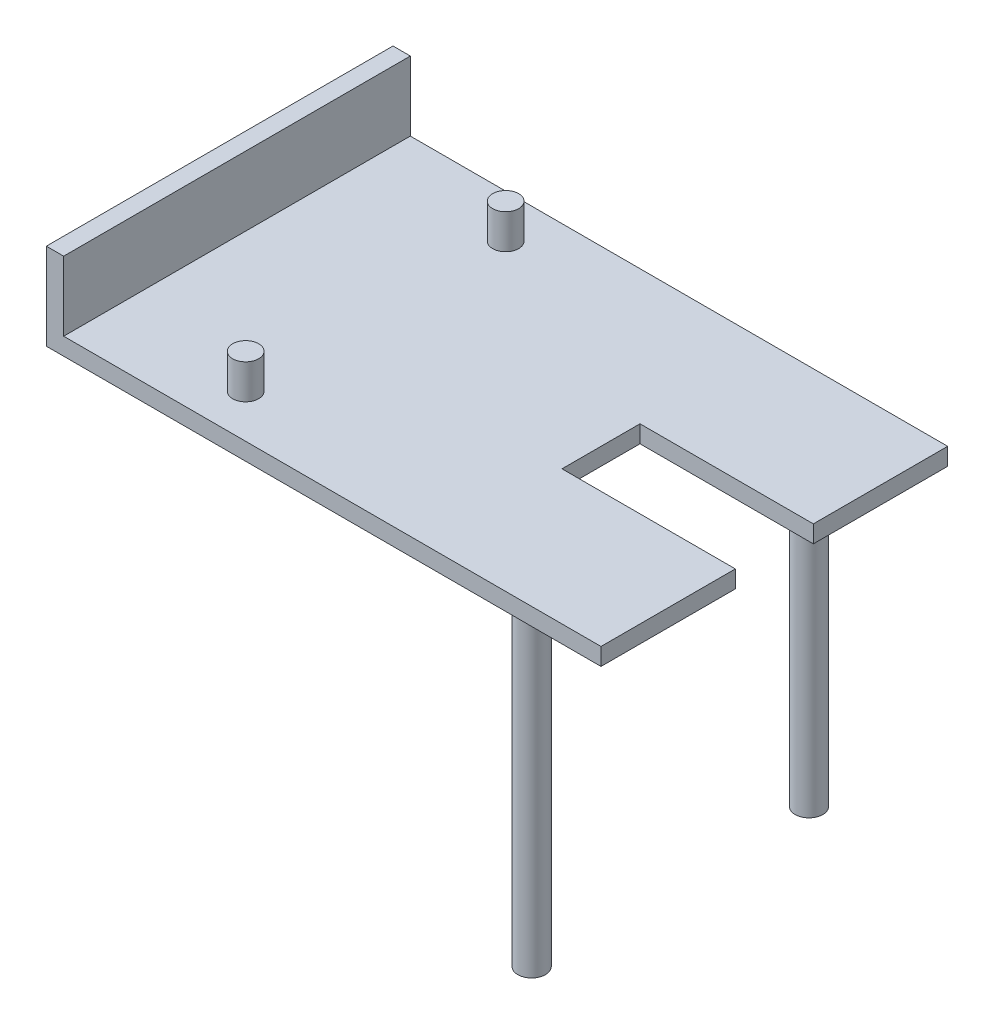
ISO-10303-21;
HEADER;
FILE_DESCRIPTION(('STEP AP214'),'2;1');
FILE_NAME('part.step','',(''),(''),'','','');
FILE_SCHEMA(('AUTOMOTIVE_DESIGN { 1 0 10303 214 1 1 1 1 }'));
ENDSEC;
DATA;
#1=APPLICATION_CONTEXT('core data for automotive mechanical design processes');
#2=APPLICATION_PROTOCOL_DEFINITION('international standard','automotive_design',2000,#1);
#3=PRODUCT_CONTEXT('',#1,'mechanical');
#4=PRODUCT('Part','Part','',(#3));
#5=PRODUCT_RELATED_PRODUCT_CATEGORY('part','',(#4));
#6=PRODUCT_DEFINITION_FORMATION('','',#4);
#7=PRODUCT_DEFINITION_CONTEXT('part definition',#1,'design');
#8=PRODUCT_DEFINITION('design','',#6,#7);
#9=PRODUCT_DEFINITION_SHAPE('','',#8);
#10=(LENGTH_UNIT() NAMED_UNIT(*) SI_UNIT(.MILLI.,.METRE.));
#11=(NAMED_UNIT(*) PLANE_ANGLE_UNIT() SI_UNIT($,.RADIAN.));
#12=(NAMED_UNIT(*) SI_UNIT($,.STERADIAN.) SOLID_ANGLE_UNIT());
#13=UNCERTAINTY_MEASURE_WITH_UNIT(LENGTH_MEASURE(1.E-05),#10,'distance_accuracy_value','');
#14=(GEOMETRIC_REPRESENTATION_CONTEXT(3) GLOBAL_UNCERTAINTY_ASSIGNED_CONTEXT((#13)) GLOBAL_UNIT_ASSIGNED_CONTEXT((#10,
#11,#12)) REPRESENTATION_CONTEXT('',''));
#15=CARTESIAN_POINT('',(0.,0.,0.));
#16=DIRECTION('',(0.,0.,1.));
#17=DIRECTION('',(1.,0.,0.));
#18=AXIS2_PLACEMENT_3D('',#15,#16,#17);
#19=CARTESIAN_POINT('',(320.,0.,200.));
#20=DIRECTION('',(-1.,0.,0.));
#21=DIRECTION('',(0.,0.,1.));
#22=AXIS2_PLACEMENT_3D('',#19,#20,#21);
#23=PLANE('',#22);
#24=DIRECTION('',(0.,0.,-1.));
#25=VECTOR('',#24,1.);
#26=CARTESIAN_POINT('',(320.,0.,200.));
#27=LINE('',#26,#25);
#28=CARTESIAN_POINT('',(320.,0.,200.));
#29=VERTEX_POINT('',#28);
#30=CARTESIAN_POINT('',(320.,0.,122.5));
#31=VERTEX_POINT('',#30);
#32=EDGE_CURVE('E124',#29,#31,#27,.T.);
#33=ORIENTED_EDGE('',*,*,#32,.T.);
#34=DIRECTION('',(0.,1.,0.));
#35=VECTOR('',#34,1.);
#36=CARTESIAN_POINT('',(320.,0.,122.5));
#37=LINE('',#36,#35);
#38=CARTESIAN_POINT('',(320.,10.,122.5));
#39=VERTEX_POINT('',#38);
#40=EDGE_CURVE('E217',#31,#39,#37,.T.);
#41=ORIENTED_EDGE('',*,*,#40,.T.);
#42=DIRECTION('',(0.,0.,-1.));
#43=VECTOR('',#42,1.);
#44=CARTESIAN_POINT('',(320.,10.,200.));
#45=LINE('',#44,#43);
#46=CARTESIAN_POINT('',(320.,10.,200.));
#47=VERTEX_POINT('',#46);
#48=EDGE_CURVE('E159',#47,#39,#45,.T.);
#49=ORIENTED_EDGE('',*,*,#48,.F.);
#50=DIRECTION('',(0.,1.,0.));
#51=VECTOR('',#50,1.);
#52=CARTESIAN_POINT('',(320.,0.,200.));
#53=LINE('',#52,#51);
#54=EDGE_CURVE('E67',#29,#47,#53,.T.);
#55=ORIENTED_EDGE('',*,*,#54,.F.);
#56=EDGE_LOOP('',(#33,#41,#49,#55));
#57=FACE_BOUND('',#56,.T.);
#58=ADVANCED_FACE('F41',(#57),#23,.F.);
#59=CARTESIAN_POINT('',(0.,10.,200.));
#60=DIRECTION('',(0.,1.,0.));
#61=DIRECTION('',(0.,0.,1.));
#62=AXIS2_PLACEMENT_3D('',#59,#60,#61);
#63=PLANE('',#62);
#64=DIRECTION('',(1.,0.,0.));
#65=VECTOR('',#64,1.);
#66=CARTESIAN_POINT('',(320.,10.,122.5));
#67=LINE('',#66,#65);
#68=CARTESIAN_POINT('',(220.,10.,122.5));
#69=VERTEX_POINT('',#68);
#70=EDGE_CURVE('E220',#69,#39,#67,.T.);
#71=ORIENTED_EDGE('',*,*,#70,.F.);
#72=DIRECTION('',(0.,0.,1.));
#73=VECTOR('',#72,1.);
#74=CARTESIAN_POINT('',(220.,10.,77.5));
#75=LINE('',#74,#73);
#76=CARTESIAN_POINT('',(220.,10.,77.5));
#77=VERTEX_POINT('',#76);
#78=EDGE_CURVE('E223',#77,#69,#75,.T.);
#79=ORIENTED_EDGE('',*,*,#78,.F.);
#80=DIRECTION('',(-1.,0.,0.));
#81=VECTOR('',#80,1.);
#82=CARTESIAN_POINT('',(320.,10.,77.4999999999999));
#83=LINE('',#82,#81);
#84=CARTESIAN_POINT('',(320.,10.,77.4999999999999));
#85=VERTEX_POINT('',#84);
#86=EDGE_CURVE('E226',#85,#77,#83,.T.);
#87=ORIENTED_EDGE('',*,*,#86,.F.);
#88=CARTESIAN_POINT('',(320.,10.,0.));
#89=VERTEX_POINT('',#88);
#90=EDGE_CURVE('E94',#85,#89,#45,.T.);
#91=ORIENTED_EDGE('',*,*,#90,.T.);
#92=DIRECTION('',(1.,0.,0.));
#93=VECTOR('',#92,1.);
#94=CARTESIAN_POINT('',(0.,10.,0.));
#95=LINE('',#94,#93);
#96=CARTESIAN_POINT('',(10.,10.,0.));
#97=VERTEX_POINT('',#96);
#98=EDGE_CURVE('E143',#97,#89,#95,.T.);
#99=ORIENTED_EDGE('',*,*,#98,.F.);
#100=DIRECTION('',(0.,0.,-1.));
#101=VECTOR('',#100,1.);
#102=CARTESIAN_POINT('',(10.,10.,200.));
#103=LINE('',#102,#101);
#104=CARTESIAN_POINT('',(10.,10.,200.));
#105=VERTEX_POINT('',#104);
#106=EDGE_CURVE('E11',#105,#97,#103,.T.);
#107=ORIENTED_EDGE('',*,*,#106,.F.);
#108=DIRECTION('',(1.,0.,0.));
#109=VECTOR('',#108,1.);
#110=CARTESIAN_POINT('',(0.,10.,200.));
#111=LINE('',#110,#109);
#112=EDGE_CURVE('E158',#105,#47,#111,.T.);
#113=ORIENTED_EDGE('',*,*,#112,.T.);
#114=ORIENTED_EDGE('',*,*,#48,.T.);
#115=EDGE_LOOP('',(#71,#79,#87,#91,#99,#107,#113,#114));
#116=FACE_BOUND('',#115,.T.);
#117=CARTESIAN_POINT('',(90.,10.,175.));
#118=DIRECTION('',(0.,1.,0.));
#119=DIRECTION('',(0.,0.,1.));
#120=AXIS2_PLACEMENT_3D('',#117,#118,#119);
#121=CIRCLE('',#120,7.50000000000001);
#122=CARTESIAN_POINT('',(90.,10.,182.5));
#123=VERTEX_POINT('',#122);
#124=EDGE_CURVE('E172',#123,#123,#121,.T.);
#125=ORIENTED_EDGE('',*,*,#124,.F.);
#126=EDGE_LOOP('',(#125));
#127=FACE_BOUND('',#126,.T.);
#128=CARTESIAN_POINT('',(90.,10.,25.));
#129=DIRECTION('',(0.,1.,0.));
#130=DIRECTION('',(0.,0.,1.));
#131=AXIS2_PLACEMENT_3D('',#128,#129,#130);
#132=CIRCLE('',#131,7.50000000000001);
#133=CARTESIAN_POINT('',(90.,10.,32.5));
#134=VERTEX_POINT('',#133);
#135=EDGE_CURVE('E184',#134,#134,#132,.T.);
#136=ORIENTED_EDGE('',*,*,#135,.F.);
#137=EDGE_LOOP('',(#136));
#138=FACE_BOUND('',#137,.T.);
#139=ADVANCED_FACE('F43',(#116,#127,#138),#63,.T.);
#140=CARTESIAN_POINT('',(10.,0.,200.));
#141=DIRECTION('',(-1.,0.,0.));
#142=DIRECTION('',(0.,0.,1.));
#143=AXIS2_PLACEMENT_3D('',#140,#141,#142);
#144=PLANE('',#143);
#145=DIRECTION('',(0.,1.,0.));
#146=VECTOR('',#145,1.);
#147=CARTESIAN_POINT('',(10.,0.,0.));
#148=LINE('',#147,#146);
#149=CARTESIAN_POINT('',(10.,50.,0.));
#150=VERTEX_POINT('',#149);
#151=EDGE_CURVE('E146',#97,#150,#148,.T.);
#152=ORIENTED_EDGE('',*,*,#151,.T.);
#153=DIRECTION('',(0.,0.,-1.));
#154=VECTOR('',#153,1.);
#155=CARTESIAN_POINT('',(10.,50.,200.));
#156=LINE('',#155,#154);
#157=CARTESIAN_POINT('',(10.,50.,200.));
#158=VERTEX_POINT('',#157);
#159=EDGE_CURVE('E50',#158,#150,#156,.T.);
#160=ORIENTED_EDGE('',*,*,#159,.F.);
#161=DIRECTION('',(0.,1.,0.));
#162=VECTOR('',#161,1.);
#163=CARTESIAN_POINT('',(10.,0.,200.));
#164=LINE('',#163,#162);
#165=EDGE_CURVE('E138',#105,#158,#164,.T.);
#166=ORIENTED_EDGE('',*,*,#165,.F.);
#167=ORIENTED_EDGE('',*,*,#106,.T.);
#168=EDGE_LOOP('',(#152,#160,#166,#167));
#169=FACE_BOUND('',#168,.T.);
#170=ADVANCED_FACE('F192',(#169),#144,.F.);
#171=CARTESIAN_POINT('',(0.,50.,200.));
#172=DIRECTION('',(0.,1.,0.));
#173=DIRECTION('',(0.,0.,1.));
#174=AXIS2_PLACEMENT_3D('',#171,#172,#173);
#175=PLANE('',#174);
#176=DIRECTION('',(1.,0.,0.));
#177=VECTOR('',#176,1.);
#178=CARTESIAN_POINT('',(0.,50.,0.));
#179=LINE('',#178,#177);
#180=CARTESIAN_POINT('',(0.,50.,0.));
#181=VERTEX_POINT('',#180);
#182=EDGE_CURVE('E150',#181,#150,#179,.T.);
#183=ORIENTED_EDGE('',*,*,#182,.F.);
#184=DIRECTION('',(0.,0.,-1.));
#185=VECTOR('',#184,1.);
#186=CARTESIAN_POINT('',(0.,50.,200.));
#187=LINE('',#186,#185);
#188=CARTESIAN_POINT('',(0.,50.,200.));
#189=VERTEX_POINT('',#188);
#190=EDGE_CURVE('E123',#189,#181,#187,.T.);
#191=ORIENTED_EDGE('',*,*,#190,.F.);
#192=DIRECTION('',(1.,0.,0.));
#193=VECTOR('',#192,1.);
#194=CARTESIAN_POINT('',(0.,50.,200.));
#195=LINE('',#194,#193);
#196=EDGE_CURVE('E136',#189,#158,#195,.T.);
#197=ORIENTED_EDGE('',*,*,#196,.T.);
#198=ORIENTED_EDGE('',*,*,#159,.T.);
#199=EDGE_LOOP('',(#183,#191,#197,#198));
#200=FACE_BOUND('',#199,.T.);
#201=ADVANCED_FACE('F196',(#200),#175,.T.);
#202=CARTESIAN_POINT('',(0.,0.,200.));
#203=DIRECTION('',(-1.,0.,0.));
#204=DIRECTION('',(0.,0.,1.));
#205=AXIS2_PLACEMENT_3D('',#202,#203,#204);
#206=PLANE('',#205);
#207=DIRECTION('',(0.,1.,0.));
#208=VECTOR('',#207,1.);
#209=CARTESIAN_POINT('',(0.,0.,0.));
#210=LINE('',#209,#208);
#211=CARTESIAN_POINT('',(0.,0.,0.));
#212=VERTEX_POINT('',#211);
#213=EDGE_CURVE('E119',#212,#181,#210,.T.);
#214=ORIENTED_EDGE('',*,*,#213,.F.);
#215=DIRECTION('',(0.,0.,-1.));
#216=VECTOR('',#215,1.);
#217=CARTESIAN_POINT('',(0.,0.,200.));
#218=LINE('',#217,#216);
#219=CARTESIAN_POINT('',(0.,0.,200.));
#220=VERTEX_POINT('',#219);
#221=EDGE_CURVE('E113',#220,#212,#218,.T.);
#222=ORIENTED_EDGE('',*,*,#221,.F.);
#223=DIRECTION('',(0.,1.,0.));
#224=VECTOR('',#223,1.);
#225=CARTESIAN_POINT('',(0.,0.,200.));
#226=LINE('',#225,#224);
#227=EDGE_CURVE('E117',#220,#189,#226,.T.);
#228=ORIENTED_EDGE('',*,*,#227,.T.);
#229=ORIENTED_EDGE('',*,*,#190,.T.);
#230=EDGE_LOOP('',(#214,#222,#228,#229));
#231=FACE_BOUND('',#230,.T.);
#232=ADVANCED_FACE('F115',(#231),#206,.T.);
#233=CARTESIAN_POINT('',(0.,0.,200.));
#234=DIRECTION('',(0.,1.,0.));
#235=DIRECTION('',(0.,0.,1.));
#236=AXIS2_PLACEMENT_3D('',#233,#234,#235);
#237=PLANE('',#236);
#238=CARTESIAN_POINT('',(260.,0.,180.));
#239=DIRECTION('',(0.,1.,0.));
#240=DIRECTION('',(0.,0.,1.));
#241=AXIS2_PLACEMENT_3D('',#238,#239,#240);
#242=CIRCLE('',#241,7.99999999999999);
#243=CARTESIAN_POINT('',(260.,0.,188.));
#244=VERTEX_POINT('',#243);
#245=EDGE_CURVE('E45',#244,#244,#242,.T.);
#246=ORIENTED_EDGE('',*,*,#245,.T.);
#247=EDGE_LOOP('',(#246));
#248=FACE_BOUND('',#247,.T.);
#249=CARTESIAN_POINT('',(260.,0.,20.));
#250=DIRECTION('',(0.,1.,0.));
#251=DIRECTION('',(0.,0.,1.));
#252=AXIS2_PLACEMENT_3D('',#249,#250,#251);
#253=CIRCLE('',#252,7.99999999999998);
#254=CARTESIAN_POINT('',(260.,0.,28.));
#255=VERTEX_POINT('',#254);
#256=EDGE_CURVE('E165',#255,#255,#253,.T.);
#257=ORIENTED_EDGE('',*,*,#256,.T.);
#258=EDGE_LOOP('',(#257));
#259=FACE_BOUND('',#258,.T.);
#260=DIRECTION('',(0.,0.,1.));
#261=VECTOR('',#260,1.);
#262=CARTESIAN_POINT('',(220.,0.,77.5));
#263=LINE('',#262,#261);
#264=CARTESIAN_POINT('',(220.,0.,77.5));
#265=VERTEX_POINT('',#264);
#266=CARTESIAN_POINT('',(220.,0.,122.5));
#267=VERTEX_POINT('',#266);
#268=EDGE_CURVE('E212',#265,#267,#263,.T.);
#269=ORIENTED_EDGE('',*,*,#268,.T.);
#270=DIRECTION('',(1.,0.,0.));
#271=VECTOR('',#270,1.);
#272=CARTESIAN_POINT('',(320.,0.,122.5));
#273=LINE('',#272,#271);
#274=EDGE_CURVE('E208',#267,#31,#273,.T.);
#275=ORIENTED_EDGE('',*,*,#274,.T.);
#276=ORIENTED_EDGE('',*,*,#32,.F.);
#277=DIRECTION('',(1.,0.,0.));
#278=VECTOR('',#277,1.);
#279=CARTESIAN_POINT('',(0.,0.,200.));
#280=LINE('',#279,#278);
#281=EDGE_CURVE('E127',#220,#29,#280,.T.);
#282=ORIENTED_EDGE('',*,*,#281,.F.);
#283=ORIENTED_EDGE('',*,*,#221,.T.);
#284=DIRECTION('',(1.,0.,0.));
#285=VECTOR('',#284,1.);
#286=CARTESIAN_POINT('',(0.,0.,0.));
#287=LINE('',#286,#285);
#288=CARTESIAN_POINT('',(320.,0.,0.));
#289=VERTEX_POINT('',#288);
#290=EDGE_CURVE('E154',#212,#289,#287,.T.);
#291=ORIENTED_EDGE('',*,*,#290,.T.);
#292=CARTESIAN_POINT('',(320.,0.,77.4999999999999));
#293=VERTEX_POINT('',#292);
#294=EDGE_CURVE('E162',#293,#289,#27,.T.);
#295=ORIENTED_EDGE('',*,*,#294,.F.);
#296=DIRECTION('',(-1.,0.,0.));
#297=VECTOR('',#296,1.);
#298=CARTESIAN_POINT('',(320.,0.,77.4999999999999));
#299=LINE('',#298,#297);
#300=EDGE_CURVE('E58',#293,#265,#299,.T.);
#301=ORIENTED_EDGE('',*,*,#300,.T.);
#302=EDGE_LOOP('',(#269,#275,#276,#282,#283,#291,#295,#301));
#303=FACE_BOUND('',#302,.T.);
#304=ADVANCED_FACE('F129',(#248,#259,#303),#237,.F.);
#305=ORIENTED_EDGE('',*,*,#90,.F.);
#306=DIRECTION('',(0.,1.,0.));
#307=VECTOR('',#306,1.);
#308=CARTESIAN_POINT('',(320.,0.,77.4999999999999));
#309=LINE('',#308,#307);
#310=EDGE_CURVE('E204',#293,#85,#309,.T.);
#311=ORIENTED_EDGE('',*,*,#310,.F.);
#312=ORIENTED_EDGE('',*,*,#294,.T.);
#313=DIRECTION('',(0.,1.,0.));
#314=VECTOR('',#313,1.);
#315=CARTESIAN_POINT('',(320.,0.,0.));
#316=LINE('',#315,#314);
#317=EDGE_CURVE('E156',#289,#89,#316,.T.);
#318=ORIENTED_EDGE('',*,*,#317,.T.);
#319=EDGE_LOOP('',(#305,#311,#312,#318));
#320=FACE_BOUND('',#319,.T.);
#321=ADVANCED_FACE('F203',(#320),#23,.F.);
#322=CARTESIAN_POINT('',(0.,0.,200.));
#323=DIRECTION('',(0.,0.,1.));
#324=DIRECTION('',(1.,0.,0.));
#325=AXIS2_PLACEMENT_3D('',#322,#323,#324);
#326=PLANE('',#325);
#327=ORIENTED_EDGE('',*,*,#112,.F.);
#328=ORIENTED_EDGE('',*,*,#165,.T.);
#329=ORIENTED_EDGE('',*,*,#196,.F.);
#330=ORIENTED_EDGE('',*,*,#227,.F.);
#331=ORIENTED_EDGE('',*,*,#281,.T.);
#332=ORIENTED_EDGE('',*,*,#54,.T.);
#333=EDGE_LOOP('',(#327,#328,#329,#330,#331,#332));
#334=FACE_BOUND('',#333,.T.);
#335=ADVANCED_FACE('F134',(#334),#326,.T.);
#336=CARTESIAN_POINT('',(0.,0.,0.));
#337=DIRECTION('',(0.,0.,1.));
#338=DIRECTION('',(1.,0.,0.));
#339=AXIS2_PLACEMENT_3D('',#336,#337,#338);
#340=PLANE('',#339);
#341=ORIENTED_EDGE('',*,*,#98,.T.);
#342=ORIENTED_EDGE('',*,*,#317,.F.);
#343=ORIENTED_EDGE('',*,*,#290,.F.);
#344=ORIENTED_EDGE('',*,*,#213,.T.);
#345=ORIENTED_EDGE('',*,*,#182,.T.);
#346=ORIENTED_EDGE('',*,*,#151,.F.);
#347=EDGE_LOOP('',(#341,#342,#343,#344,#345,#346));
#348=FACE_BOUND('',#347,.T.);
#349=ADVANCED_FACE('F198',(#348),#340,.F.);
#350=CARTESIAN_POINT('',(90.,30.,25.));
#351=DIRECTION('',(0.,-1.,0.));
#352=DIRECTION('',(0.,0.,-1.));
#353=AXIS2_PLACEMENT_3D('',#350,#351,#352);
#354=CYLINDRICAL_SURFACE('',#353,7.50000000000001);
#355=CARTESIAN_POINT('',(90.,30.,25.));
#356=DIRECTION('',(0.,1.,0.));
#357=DIRECTION('',(0.,0.,1.));
#358=AXIS2_PLACEMENT_3D('',#355,#356,#357);
#359=CIRCLE('',#358,7.50000000000001);
#360=CARTESIAN_POINT('',(90.,30.,32.5));
#361=VERTEX_POINT('',#360);
#362=EDGE_CURVE('E147',#361,#361,#359,.T.);
#363=ORIENTED_EDGE('',*,*,#362,.F.);
#364=EDGE_LOOP('',(#363));
#365=FACE_BOUND('',#364,.T.);
#366=ORIENTED_EDGE('',*,*,#135,.T.);
#367=EDGE_LOOP('',(#366));
#368=FACE_BOUND('',#367,.T.);
#369=ADVANCED_FACE('F301',(#365,#368),#354,.T.);
#370=CARTESIAN_POINT('',(90.,30.,25.));
#371=DIRECTION('',(0.,1.,0.));
#372=DIRECTION('',(0.,0.,1.));
#373=AXIS2_PLACEMENT_3D('',#370,#371,#372);
#374=PLANE('',#373);
#375=ORIENTED_EDGE('',*,*,#362,.T.);
#376=EDGE_LOOP('',(#375));
#377=FACE_BOUND('',#376,.T.);
#378=ADVANCED_FACE('F310',(#377),#374,.T.);
#379=CARTESIAN_POINT('',(90.,30.,175.));
#380=DIRECTION('',(0.,-1.,0.));
#381=DIRECTION('',(0.,0.,-1.));
#382=AXIS2_PLACEMENT_3D('',#379,#380,#381);
#383=CYLINDRICAL_SURFACE('',#382,7.50000000000001);
#384=CARTESIAN_POINT('',(90.,30.,175.));
#385=DIRECTION('',(0.,1.,0.));
#386=DIRECTION('',(0.,0.,1.));
#387=AXIS2_PLACEMENT_3D('',#384,#385,#386);
#388=CIRCLE('',#387,7.50000000000001);
#389=CARTESIAN_POINT('',(90.,30.,182.5));
#390=VERTEX_POINT('',#389);
#391=EDGE_CURVE('E167',#390,#390,#388,.T.);
#392=ORIENTED_EDGE('',*,*,#391,.F.);
#393=EDGE_LOOP('',(#392));
#394=FACE_BOUND('',#393,.T.);
#395=ORIENTED_EDGE('',*,*,#124,.T.);
#396=EDGE_LOOP('',(#395));
#397=FACE_BOUND('',#396,.T.);
#398=ADVANCED_FACE('F321',(#394,#397),#383,.T.);
#399=CARTESIAN_POINT('',(90.,30.,175.));
#400=DIRECTION('',(0.,1.,0.));
#401=DIRECTION('',(0.,0.,1.));
#402=AXIS2_PLACEMENT_3D('',#399,#400,#401);
#403=PLANE('',#402);
#404=ORIENTED_EDGE('',*,*,#391,.T.);
#405=EDGE_LOOP('',(#404));
#406=FACE_BOUND('',#405,.T.);
#407=ADVANCED_FACE('F332',(#406),#403,.T.);
#408=CARTESIAN_POINT('',(260.,-190.,20.));
#409=DIRECTION('',(0.,1.,0.));
#410=DIRECTION('',(0.,0.,1.));
#411=AXIS2_PLACEMENT_3D('',#408,#409,#410);
#412=CYLINDRICAL_SURFACE('',#411,7.99999999999998);
#413=CARTESIAN_POINT('',(260.,-190.,20.));
#414=DIRECTION('',(0.,1.,0.));
#415=DIRECTION('',(0.,0.,1.));
#416=AXIS2_PLACEMENT_3D('',#413,#414,#415);
#417=CIRCLE('',#416,7.99999999999998);
#418=CARTESIAN_POINT('',(260.,-190.,28.));
#419=VERTEX_POINT('',#418);
#420=EDGE_CURVE('E168',#419,#419,#417,.T.);
#421=ORIENTED_EDGE('',*,*,#420,.T.);
#422=EDGE_LOOP('',(#421));
#423=FACE_BOUND('',#422,.T.);
#424=ORIENTED_EDGE('',*,*,#256,.F.);
#425=EDGE_LOOP('',(#424));
#426=FACE_BOUND('',#425,.T.);
#427=ADVANCED_FACE('F343',(#423,#426),#412,.T.);
#428=CARTESIAN_POINT('',(260.,-190.,20.));
#429=DIRECTION('',(0.,1.,0.));
#430=DIRECTION('',(0.,0.,1.));
#431=AXIS2_PLACEMENT_3D('',#428,#429,#430);
#432=PLANE('',#431);
#433=ORIENTED_EDGE('',*,*,#420,.F.);
#434=EDGE_LOOP('',(#433));
#435=FACE_BOUND('',#434,.T.);
#436=ADVANCED_FACE('F354',(#435),#432,.F.);
#437=CARTESIAN_POINT('',(260.,-190.,180.));
#438=DIRECTION('',(0.,1.,0.));
#439=DIRECTION('',(0.,0.,1.));
#440=AXIS2_PLACEMENT_3D('',#437,#438,#439);
#441=CYLINDRICAL_SURFACE('',#440,7.99999999999999);
#442=CARTESIAN_POINT('',(260.,-190.,180.));
#443=DIRECTION('',(0.,1.,0.));
#444=DIRECTION('',(0.,0.,1.));
#445=AXIS2_PLACEMENT_3D('',#442,#443,#444);
#446=CIRCLE('',#445,7.99999999999999);
#447=CARTESIAN_POINT('',(260.,-190.,188.));
#448=VERTEX_POINT('',#447);
#449=EDGE_CURVE('E179',#448,#448,#446,.T.);
#450=ORIENTED_EDGE('',*,*,#449,.T.);
#451=EDGE_LOOP('',(#450));
#452=FACE_BOUND('',#451,.T.);
#453=ORIENTED_EDGE('',*,*,#245,.F.);
#454=EDGE_LOOP('',(#453));
#455=FACE_BOUND('',#454,.T.);
#456=ADVANCED_FACE('F364',(#452,#455),#441,.T.);
#457=CARTESIAN_POINT('',(260.,-190.,180.));
#458=DIRECTION('',(0.,1.,0.));
#459=DIRECTION('',(0.,0.,1.));
#460=AXIS2_PLACEMENT_3D('',#457,#458,#459);
#461=PLANE('',#460);
#462=ORIENTED_EDGE('',*,*,#449,.F.);
#463=EDGE_LOOP('',(#462));
#464=FACE_BOUND('',#463,.T.);
#465=ADVANCED_FACE('F375',(#464),#461,.F.);
#466=CARTESIAN_POINT('',(320.,0.,122.5));
#467=DIRECTION('',(0.,0.,1.));
#468=DIRECTION('',(1.,0.,0.));
#469=AXIS2_PLACEMENT_3D('',#466,#467,#468);
#470=PLANE('',#469);
#471=ORIENTED_EDGE('',*,*,#70,.T.);
#472=ORIENTED_EDGE('',*,*,#40,.F.);
#473=ORIENTED_EDGE('',*,*,#274,.F.);
#474=DIRECTION('',(0.,1.,0.));
#475=VECTOR('',#474,1.);
#476=CARTESIAN_POINT('',(220.,0.,122.5));
#477=LINE('',#476,#475);
#478=EDGE_CURVE('E210',#267,#69,#477,.T.);
#479=ORIENTED_EDGE('',*,*,#478,.T.);
#480=EDGE_LOOP('',(#471,#472,#473,#479));
#481=FACE_BOUND('',#480,.T.);
#482=ADVANCED_FACE('F244',(#481),#470,.F.);
#483=CARTESIAN_POINT('',(220.,0.,77.5));
#484=DIRECTION('',(-1.,0.,0.));
#485=DIRECTION('',(0.,0.,1.));
#486=AXIS2_PLACEMENT_3D('',#483,#484,#485);
#487=PLANE('',#486);
#488=ORIENTED_EDGE('',*,*,#78,.T.);
#489=ORIENTED_EDGE('',*,*,#478,.F.);
#490=ORIENTED_EDGE('',*,*,#268,.F.);
#491=DIRECTION('',(0.,1.,0.));
#492=VECTOR('',#491,1.);
#493=CARTESIAN_POINT('',(220.,0.,77.5));
#494=LINE('',#493,#492);
#495=EDGE_CURVE('E207',#265,#77,#494,.T.);
#496=ORIENTED_EDGE('',*,*,#495,.T.);
#497=EDGE_LOOP('',(#488,#489,#490,#496));
#498=FACE_BOUND('',#497,.T.);
#499=ADVANCED_FACE('F235',(#498),#487,.F.);
#500=CARTESIAN_POINT('',(320.,0.,77.4999999999999));
#501=DIRECTION('',(0.,0.,-1.));
#502=DIRECTION('',(-1.,0.,0.));
#503=AXIS2_PLACEMENT_3D('',#500,#501,#502);
#504=PLANE('',#503);
#505=ORIENTED_EDGE('',*,*,#86,.T.);
#506=ORIENTED_EDGE('',*,*,#495,.F.);
#507=ORIENTED_EDGE('',*,*,#300,.F.);
#508=ORIENTED_EDGE('',*,*,#310,.T.);
#509=EDGE_LOOP('',(#505,#506,#507,#508));
#510=FACE_BOUND('',#509,.T.);
#511=ADVANCED_FACE('F424',(#510),#504,.F.);
#512=CLOSED_SHELL('',(#58,#139,#170,#201,#232,#304,#321,#335,#349,#369,#378,#398,#407,#427,#436,
#456,#465,#482,#499,#511));
#513=MANIFOLD_SOLID_BREP('B2',#512);
#514=ADVANCED_BREP_SHAPE_REPRESENTATION('',(#18,#513),#14);
#515=SHAPE_DEFINITION_REPRESENTATION(#9,#514);
ENDSEC;
END-ISO-10303-21;
